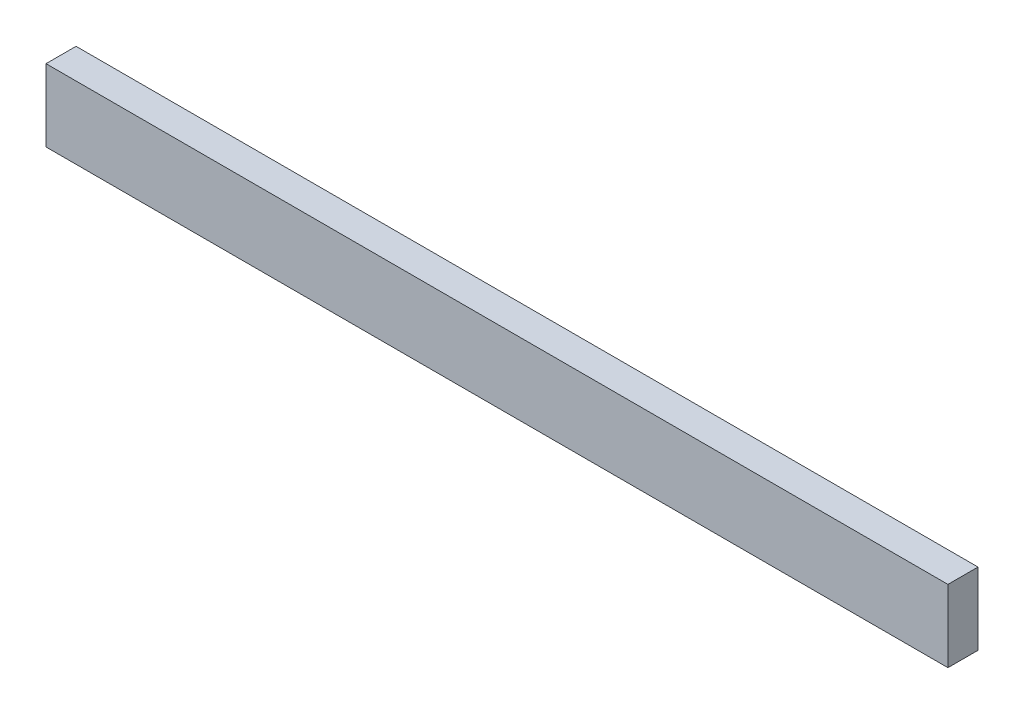
ISO-10303-21;
HEADER;
FILE_DESCRIPTION(('STEP AP214'),'2;1');
FILE_NAME('part.step','',(''),(''),'','','');
FILE_SCHEMA(('AUTOMOTIVE_DESIGN { 1 0 10303 214 1 1 1 1 }'));
ENDSEC;
DATA;
#1=APPLICATION_CONTEXT('core data for automotive mechanical design processes');
#2=APPLICATION_PROTOCOL_DEFINITION('international standard','automotive_design',2000,#1);
#3=PRODUCT_CONTEXT('',#1,'mechanical');
#4=PRODUCT('Part','Part','',(#3));
#5=PRODUCT_RELATED_PRODUCT_CATEGORY('part','',(#4));
#6=PRODUCT_DEFINITION_FORMATION('','',#4);
#7=PRODUCT_DEFINITION_CONTEXT('part definition',#1,'design');
#8=PRODUCT_DEFINITION('design','',#6,#7);
#9=PRODUCT_DEFINITION_SHAPE('','',#8);
#10=(LENGTH_UNIT() NAMED_UNIT(*) SI_UNIT(.MILLI.,.METRE.));
#11=(NAMED_UNIT(*) PLANE_ANGLE_UNIT() SI_UNIT($,.RADIAN.));
#12=(NAMED_UNIT(*) SI_UNIT($,.STERADIAN.) SOLID_ANGLE_UNIT());
#13=UNCERTAINTY_MEASURE_WITH_UNIT(LENGTH_MEASURE(1.E-05),#10,'distance_accuracy_value','');
#14=(GEOMETRIC_REPRESENTATION_CONTEXT(3) GLOBAL_UNCERTAINTY_ASSIGNED_CONTEXT((#13)) GLOBAL_UNIT_ASSIGNED_CONTEXT((#10,
#11,#12)) REPRESENTATION_CONTEXT('',''));
#15=CARTESIAN_POINT('',(0.,0.,0.));
#16=DIRECTION('',(0.,0.,1.));
#17=DIRECTION('',(1.,0.,0.));
#18=AXIS2_PLACEMENT_3D('',#15,#16,#17);
#19=CARTESIAN_POINT('',(0.,0.,25.));
#20=DIRECTION('',(1.,0.,0.));
#21=DIRECTION('',(0.,0.,-1.));
#22=AXIS2_PLACEMENT_3D('',#19,#20,#21);
#23=PLANE('',#22);
#24=DIRECTION('',(0.,-1.,0.));
#25=VECTOR('',#24,1.);
#26=CARTESIAN_POINT('',(0.,0.,0.));
#27=LINE('',#26,#25);
#28=CARTESIAN_POINT('',(0.,60.,0.));
#29=VERTEX_POINT('',#28);
#30=CARTESIAN_POINT('',(0.,0.,0.));
#31=VERTEX_POINT('',#30);
#32=EDGE_CURVE('E96',#29,#31,#27,.T.);
#33=ORIENTED_EDGE('',*,*,#32,.T.);
#34=DIRECTION('',(0.,0.,-1.));
#35=VECTOR('',#34,1.);
#36=CARTESIAN_POINT('',(0.,0.,25.));
#37=LINE('',#36,#35);
#38=CARTESIAN_POINT('',(0.,0.,25.));
#39=VERTEX_POINT('',#38);
#40=EDGE_CURVE('E11',#39,#31,#37,.T.);
#41=ORIENTED_EDGE('',*,*,#40,.F.);
#42=DIRECTION('',(0.,-1.,0.));
#43=VECTOR('',#42,1.);
#44=CARTESIAN_POINT('',(0.,0.,25.));
#45=LINE('',#44,#43);
#46=CARTESIAN_POINT('',(0.,60.,25.));
#47=VERTEX_POINT('',#46);
#48=EDGE_CURVE('E84',#47,#39,#45,.T.);
#49=ORIENTED_EDGE('',*,*,#48,.F.);
#50=DIRECTION('',(0.,0.,-1.));
#51=VECTOR('',#50,1.);
#52=CARTESIAN_POINT('',(0.,60.,25.));
#53=LINE('',#52,#51);
#54=EDGE_CURVE('E92',#47,#29,#53,.T.);
#55=ORIENTED_EDGE('',*,*,#54,.T.);
#56=EDGE_LOOP('',(#33,#41,#49,#55));
#57=FACE_BOUND('',#56,.T.);
#58=ADVANCED_FACE('F33',(#57),#23,.F.);
#59=CARTESIAN_POINT('',(0.,0.,25.));
#60=DIRECTION('',(0.,1.,0.));
#61=DIRECTION('',(0.,0.,1.));
#62=AXIS2_PLACEMENT_3D('',#59,#60,#61);
#63=PLANE('',#62);
#64=DIRECTION('',(1.,0.,0.));
#65=VECTOR('',#64,1.);
#66=CARTESIAN_POINT('',(0.,0.,0.));
#67=LINE('',#66,#65);
#68=CARTESIAN_POINT('',(750.,0.,0.));
#69=VERTEX_POINT('',#68);
#70=EDGE_CURVE('E88',#31,#69,#67,.T.);
#71=ORIENTED_EDGE('',*,*,#70,.T.);
#72=DIRECTION('',(0.,0.,-1.));
#73=VECTOR('',#72,1.);
#74=CARTESIAN_POINT('',(750.,0.,25.));
#75=LINE('',#74,#73);
#76=CARTESIAN_POINT('',(750.,0.,25.));
#77=VERTEX_POINT('',#76);
#78=EDGE_CURVE('E41',#77,#69,#75,.T.);
#79=ORIENTED_EDGE('',*,*,#78,.F.);
#80=DIRECTION('',(1.,0.,0.));
#81=VECTOR('',#80,1.);
#82=CARTESIAN_POINT('',(0.,0.,25.));
#83=LINE('',#82,#81);
#84=EDGE_CURVE('E79',#39,#77,#83,.T.);
#85=ORIENTED_EDGE('',*,*,#84,.F.);
#86=ORIENTED_EDGE('',*,*,#40,.T.);
#87=EDGE_LOOP('',(#71,#79,#85,#86));
#88=FACE_BOUND('',#87,.T.);
#89=ADVANCED_FACE('F87',(#88),#63,.F.);
#90=CARTESIAN_POINT('',(750.,0.,25.));
#91=DIRECTION('',(-1.,0.,0.));
#92=DIRECTION('',(0.,0.,1.));
#93=AXIS2_PLACEMENT_3D('',#90,#91,#92);
#94=PLANE('',#93);
#95=DIRECTION('',(0.,1.,0.));
#96=VECTOR('',#95,1.);
#97=CARTESIAN_POINT('',(750.,0.,0.));
#98=LINE('',#97,#96);
#99=CARTESIAN_POINT('',(750.,60.,0.));
#100=VERTEX_POINT('',#99);
#101=EDGE_CURVE('E66',#69,#100,#98,.T.);
#102=ORIENTED_EDGE('',*,*,#101,.T.);
#103=DIRECTION('',(0.,0.,-1.));
#104=VECTOR('',#103,1.);
#105=CARTESIAN_POINT('',(750.,60.,25.));
#106=LINE('',#105,#104);
#107=CARTESIAN_POINT('',(750.,60.,25.));
#108=VERTEX_POINT('',#107);
#109=EDGE_CURVE('E89',#108,#100,#106,.T.);
#110=ORIENTED_EDGE('',*,*,#109,.F.);
#111=DIRECTION('',(0.,1.,0.));
#112=VECTOR('',#111,1.);
#113=CARTESIAN_POINT('',(750.,0.,25.));
#114=LINE('',#113,#112);
#115=EDGE_CURVE('E82',#77,#108,#114,.T.);
#116=ORIENTED_EDGE('',*,*,#115,.F.);
#117=ORIENTED_EDGE('',*,*,#78,.T.);
#118=EDGE_LOOP('',(#102,#110,#116,#117));
#119=FACE_BOUND('',#118,.T.);
#120=ADVANCED_FACE('F90',(#119),#94,.F.);
#121=CARTESIAN_POINT('',(0.,60.,25.));
#122=DIRECTION('',(0.,-1.,0.));
#123=DIRECTION('',(0.,0.,-1.));
#124=AXIS2_PLACEMENT_3D('',#121,#122,#123);
#125=PLANE('',#124);
#126=DIRECTION('',(-1.,0.,0.));
#127=VECTOR('',#126,1.);
#128=CARTESIAN_POINT('',(0.,60.,0.));
#129=LINE('',#128,#127);
#130=EDGE_CURVE('E72',#100,#29,#129,.T.);
#131=ORIENTED_EDGE('',*,*,#130,.T.);
#132=ORIENTED_EDGE('',*,*,#54,.F.);
#133=DIRECTION('',(-1.,0.,0.));
#134=VECTOR('',#133,1.);
#135=CARTESIAN_POINT('',(0.,60.,25.));
#136=LINE('',#135,#134);
#137=EDGE_CURVE('E49',#108,#47,#136,.T.);
#138=ORIENTED_EDGE('',*,*,#137,.F.);
#139=ORIENTED_EDGE('',*,*,#109,.T.);
#140=EDGE_LOOP('',(#131,#132,#138,#139));
#141=FACE_BOUND('',#140,.T.);
#142=ADVANCED_FACE('F103',(#141),#125,.F.);
#143=CARTESIAN_POINT('',(0.,0.,25.));
#144=DIRECTION('',(0.,0.,-1.));
#145=DIRECTION('',(-1.,0.,0.));
#146=AXIS2_PLACEMENT_3D('',#143,#144,#145);
#147=PLANE('',#146);
#148=ORIENTED_EDGE('',*,*,#48,.T.);
#149=ORIENTED_EDGE('',*,*,#84,.T.);
#150=ORIENTED_EDGE('',*,*,#115,.T.);
#151=ORIENTED_EDGE('',*,*,#137,.T.);
#152=EDGE_LOOP('',(#148,#149,#150,#151));
#153=FACE_BOUND('',#152,.T.);
#154=ADVANCED_FACE('F80',(#153),#147,.F.);
#155=CARTESIAN_POINT('',(0.,0.,0.));
#156=DIRECTION('',(0.,0.,-1.));
#157=DIRECTION('',(-1.,0.,0.));
#158=AXIS2_PLACEMENT_3D('',#155,#156,#157);
#159=PLANE('',#158);
#160=ORIENTED_EDGE('',*,*,#32,.F.);
#161=ORIENTED_EDGE('',*,*,#130,.F.);
#162=ORIENTED_EDGE('',*,*,#101,.F.);
#163=ORIENTED_EDGE('',*,*,#70,.F.);
#164=EDGE_LOOP('',(#160,#161,#162,#163));
#165=FACE_BOUND('',#164,.T.);
#166=ADVANCED_FACE('F106',(#165),#159,.T.);
#167=CLOSED_SHELL('',(#58,#89,#120,#142,#154,#166));
#168=MANIFOLD_SOLID_BREP('B2',#167);
#169=ADVANCED_BREP_SHAPE_REPRESENTATION('',(#18,#168),#14);
#170=SHAPE_DEFINITION_REPRESENTATION(#9,#169);
ENDSEC;
END-ISO-10303-21;
